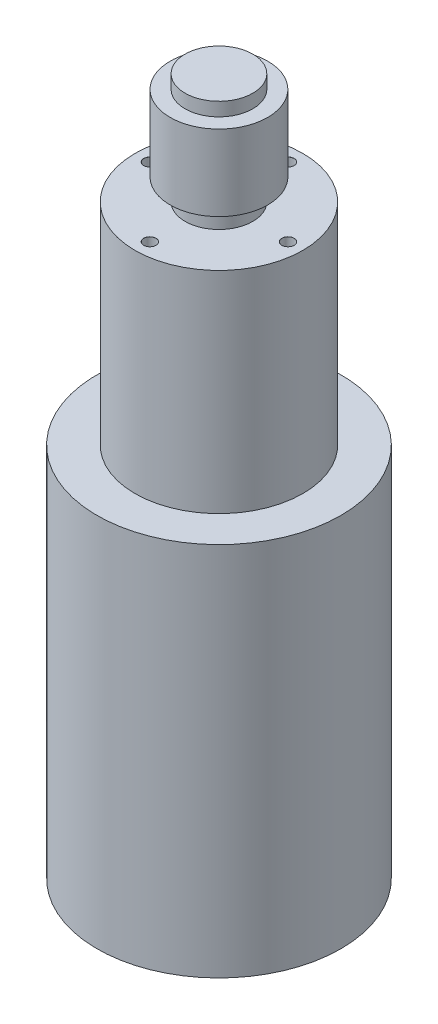
ISO-10303-21;
HEADER;
FILE_DESCRIPTION(('STEP AP214'),'2;1');
FILE_NAME('part.step','',(''),(''),'','','');
FILE_SCHEMA(('AUTOMOTIVE_DESIGN { 1 0 10303 214 1 1 1 1 }'));
ENDSEC;
DATA;
#1=APPLICATION_CONTEXT('core data for automotive mechanical design processes');
#2=APPLICATION_PROTOCOL_DEFINITION('international standard','automotive_design',2000,#1);
#3=PRODUCT_CONTEXT('',#1,'mechanical');
#4=PRODUCT('Part','Part','',(#3));
#5=PRODUCT_RELATED_PRODUCT_CATEGORY('part','',(#4));
#6=PRODUCT_DEFINITION_FORMATION('','',#4);
#7=PRODUCT_DEFINITION_CONTEXT('part definition',#1,'design');
#8=PRODUCT_DEFINITION('design','',#6,#7);
#9=PRODUCT_DEFINITION_SHAPE('','',#8);
#10=(LENGTH_UNIT() NAMED_UNIT(*) SI_UNIT(.MILLI.,.METRE.));
#11=(NAMED_UNIT(*) PLANE_ANGLE_UNIT() SI_UNIT($,.RADIAN.));
#12=(NAMED_UNIT(*) SI_UNIT($,.STERADIAN.) SOLID_ANGLE_UNIT());
#13=UNCERTAINTY_MEASURE_WITH_UNIT(LENGTH_MEASURE(1.E-05),#10,'distance_accuracy_value','');
#14=(GEOMETRIC_REPRESENTATION_CONTEXT(3) GLOBAL_UNCERTAINTY_ASSIGNED_CONTEXT((#13)) GLOBAL_UNIT_ASSIGNED_CONTEXT((#10,
#11,#12)) REPRESENTATION_CONTEXT('',''));
#15=CARTESIAN_POINT('',(0.,0.,0.));
#16=DIRECTION('',(0.,0.,1.));
#17=DIRECTION('',(1.,0.,0.));
#18=AXIS2_PLACEMENT_3D('',#15,#16,#17);
#19=CARTESIAN_POINT('',(0.,257.3,0.));
#20=DIRECTION('',(0.,1.,0.));
#21=DIRECTION('',(-1.,0.,0.));
#22=AXIS2_PLACEMENT_3D('',#19,#20,#21);
#23=PLANE('',#22);
#24=CARTESIAN_POINT('',(-8.82603067413309E-13,257.3,0.));
#25=DIRECTION('',(0.,-1.,0.));
#26=DIRECTION('',(1.,0.,0.));
#27=AXIS2_PLACEMENT_3D('',#24,#25,#26);
#28=CIRCLE('',#27,12.5000000000009);
#29=CARTESIAN_POINT('',(12.5,257.3,0.));
#30=VERTEX_POINT('',#29);
#31=EDGE_CURVE('E11',#30,#30,#28,.T.);
#32=ORIENTED_EDGE('',*,*,#31,.F.);
#33=EDGE_LOOP('',(#32));
#34=FACE_BOUND('',#33,.T.);
#35=ADVANCED_FACE('F32',(#34),#23,.T.);
#36=CARTESIAN_POINT('',(4.05590653340269E-12,-1182.39420366281,0.));
#37=DIRECTION('',(0.,-1.,0.));
#38=DIRECTION('',(1.,0.,0.));
#39=AXIS2_PLACEMENT_3D('',#36,#37,#38);
#40=CYLINDRICAL_SURFACE('',#39,12.5000000000009);
#41=ORIENTED_EDGE('',*,*,#31,.T.);
#42=EDGE_LOOP('',(#41));
#43=FACE_BOUND('',#42,.T.);
#44=CARTESIAN_POINT('',(-8.6545182241888E-13,252.3,0.));
#45=DIRECTION('',(0.,-1.,0.));
#46=DIRECTION('',(1.,0.,0.));
#47=AXIS2_PLACEMENT_3D('',#44,#45,#46);
#48=CIRCLE('',#47,12.5000000000009);
#49=CARTESIAN_POINT('',(12.5,252.3,0.));
#50=VERTEX_POINT('',#49);
#51=EDGE_CURVE('E39',#50,#50,#48,.T.);
#52=ORIENTED_EDGE('',*,*,#51,.F.);
#53=EDGE_LOOP('',(#52));
#54=FACE_BOUND('',#53,.T.);
#55=ADVANCED_FACE('F125',(#43,#54),#40,.T.);
#56=CARTESIAN_POINT('',(12.5,252.3,0.));
#57=DIRECTION('',(0.,1.,0.));
#58=DIRECTION('',(-1.,0.,0.));
#59=AXIS2_PLACEMENT_3D('',#56,#57,#58);
#60=PLANE('',#59);
#61=ORIENTED_EDGE('',*,*,#51,.T.);
#62=EDGE_LOOP('',(#61));
#63=FACE_BOUND('',#62,.T.);
#64=CARTESIAN_POINT('',(-8.6545182241888E-13,252.3,0.));
#65=DIRECTION('',(0.,-1.,0.));
#66=DIRECTION('',(1.,0.,0.));
#67=AXIS2_PLACEMENT_3D('',#64,#65,#66);
#68=CIRCLE('',#67,18.0000000000009);
#69=CARTESIAN_POINT('',(18.,252.3,0.));
#70=VERTEX_POINT('',#69);
#71=EDGE_CURVE('E117',#70,#70,#68,.T.);
#72=ORIENTED_EDGE('',*,*,#71,.F.);
#73=EDGE_LOOP('',(#72));
#74=FACE_BOUND('',#73,.T.);
#75=ADVANCED_FACE('F122',(#63,#74),#60,.T.);
#76=CARTESIAN_POINT('',(4.05590653340269E-12,-1182.39420366281,0.));
#77=DIRECTION('',(0.,-1.,0.));
#78=DIRECTION('',(1.,0.,0.));
#79=AXIS2_PLACEMENT_3D('',#76,#77,#78);
#80=CYLINDRICAL_SURFACE('',#79,18.0000000000008);
#81=ORIENTED_EDGE('',*,*,#71,.T.);
#82=EDGE_LOOP('',(#81));
#83=FACE_BOUND('',#82,.T.);
#84=CARTESIAN_POINT('',(-7.69404850450078E-13,224.3,0.));
#85=DIRECTION('',(0.,-1.,0.));
#86=DIRECTION('',(1.,0.,0.));
#87=AXIS2_PLACEMENT_3D('',#84,#85,#86);
#88=CIRCLE('',#87,18.0000000000008);
#89=CARTESIAN_POINT('',(18.,224.3,0.));
#90=VERTEX_POINT('',#89);
#91=EDGE_CURVE('E114',#90,#90,#88,.T.);
#92=ORIENTED_EDGE('',*,*,#91,.F.);
#93=EDGE_LOOP('',(#92));
#94=FACE_BOUND('',#93,.T.);
#95=ADVANCED_FACE('F132',(#83,#94),#80,.T.);
#96=CARTESIAN_POINT('',(18.,224.3,0.));
#97=DIRECTION('',(0.,-1.,0.));
#98=DIRECTION('',(1.,0.,0.));
#99=AXIS2_PLACEMENT_3D('',#96,#97,#98);
#100=PLANE('',#99);
#101=ORIENTED_EDGE('',*,*,#91,.T.);
#102=EDGE_LOOP('',(#101));
#103=FACE_BOUND('',#102,.T.);
#104=CARTESIAN_POINT('',(-7.69404850450078E-13,224.3,0.));
#105=DIRECTION('',(0.,-1.,0.));
#106=DIRECTION('',(1.,0.,0.));
#107=AXIS2_PLACEMENT_3D('',#104,#105,#106);
#108=CIRCLE('',#107,12.5000000000008);
#109=CARTESIAN_POINT('',(12.5,224.3,0.));
#110=VERTEX_POINT('',#109);
#111=EDGE_CURVE('E111',#110,#110,#108,.T.);
#112=ORIENTED_EDGE('',*,*,#111,.F.);
#113=EDGE_LOOP('',(#112));
#114=FACE_BOUND('',#113,.T.);
#115=ADVANCED_FACE('F138',(#103,#114),#100,.T.);
#116=CARTESIAN_POINT('',(4.05590653340269E-12,-1182.39420366281,0.));
#117=DIRECTION('',(0.,-1.,0.));
#118=DIRECTION('',(1.,0.,0.));
#119=AXIS2_PLACEMENT_3D('',#116,#117,#118);
#120=CYLINDRICAL_SURFACE('',#119,12.5000000000008);
#121=ORIENTED_EDGE('',*,*,#111,.T.);
#122=EDGE_LOOP('',(#121));
#123=FACE_BOUND('',#122,.T.);
#124=CARTESIAN_POINT('',(-7.41962858458992E-13,216.3,0.));
#125=DIRECTION('',(0.,-1.,0.));
#126=DIRECTION('',(1.,0.,0.));
#127=AXIS2_PLACEMENT_3D('',#124,#125,#126);
#128=CIRCLE('',#127,12.5000000000007);
#129=CARTESIAN_POINT('',(12.5,216.3,0.));
#130=VERTEX_POINT('',#129);
#131=EDGE_CURVE('E108',#130,#130,#128,.T.);
#132=ORIENTED_EDGE('',*,*,#131,.F.);
#133=EDGE_LOOP('',(#132));
#134=FACE_BOUND('',#133,.T.);
#135=ADVANCED_FACE('F142',(#123,#134),#120,.T.);
#136=CARTESIAN_POINT('',(12.5,216.3,0.));
#137=DIRECTION('',(0.,1.,0.));
#138=DIRECTION('',(-1.,0.,0.));
#139=AXIS2_PLACEMENT_3D('',#136,#137,#138);
#140=PLANE('',#139);
#141=CARTESIAN_POINT('',(-7.41962858458991E-13,216.3,-25.5));
#142=DIRECTION('',(0.,1.,0.));
#143=DIRECTION('',(0.,0.,1.));
#144=AXIS2_PLACEMENT_3D('',#141,#142,#143);
#145=CIRCLE('',#144,2.275);
#146=CARTESIAN_POINT('',(-7.41962858458991E-13,216.3,-23.225));
#147=VERTEX_POINT('',#146);
#148=EDGE_CURVE('E69',#147,#147,#145,.T.);
#149=ORIENTED_EDGE('',*,*,#148,.F.);
#150=EDGE_LOOP('',(#149));
#151=FACE_BOUND('',#150,.T.);
#152=CARTESIAN_POINT('',(25.4999999999993,216.3,0.));
#153=DIRECTION('',(0.,1.,0.));
#154=DIRECTION('',(0.,0.,1.));
#155=AXIS2_PLACEMENT_3D('',#152,#153,#154);
#156=CIRCLE('',#155,2.275);
#157=CARTESIAN_POINT('',(25.4999999999993,216.3,2.275));
#158=VERTEX_POINT('',#157);
#159=EDGE_CURVE('E62',#158,#158,#156,.T.);
#160=ORIENTED_EDGE('',*,*,#159,.F.);
#161=EDGE_LOOP('',(#160));
#162=FACE_BOUND('',#161,.T.);
#163=CARTESIAN_POINT('',(-7.41962858458991E-13,216.3,25.5));
#164=DIRECTION('',(0.,1.,0.));
#165=DIRECTION('',(0.,0.,1.));
#166=AXIS2_PLACEMENT_3D('',#163,#164,#165);
#167=CIRCLE('',#166,2.275);
#168=CARTESIAN_POINT('',(-7.41962858458991E-13,216.3,27.775));
#169=VERTEX_POINT('',#168);
#170=EDGE_CURVE('E78',#169,#169,#167,.T.);
#171=ORIENTED_EDGE('',*,*,#170,.F.);
#172=EDGE_LOOP('',(#171));
#173=FACE_BOUND('',#172,.T.);
#174=CARTESIAN_POINT('',(-25.5000000000007,216.3,0.));
#175=DIRECTION('',(0.,1.,0.));
#176=DIRECTION('',(0.,0.,1.));
#177=AXIS2_PLACEMENT_3D('',#174,#175,#176);
#178=CIRCLE('',#177,2.275);
#179=CARTESIAN_POINT('',(-25.5000000000007,216.3,2.275));
#180=VERTEX_POINT('',#179);
#181=EDGE_CURVE('E87',#180,#180,#178,.T.);
#182=ORIENTED_EDGE('',*,*,#181,.F.);
#183=EDGE_LOOP('',(#182));
#184=FACE_BOUND('',#183,.T.);
#185=ORIENTED_EDGE('',*,*,#131,.T.);
#186=EDGE_LOOP('',(#185));
#187=FACE_BOUND('',#186,.T.);
#188=CARTESIAN_POINT('',(-7.41962858458992E-13,216.3,0.));
#189=DIRECTION('',(0.,-1.,0.));
#190=DIRECTION('',(1.,0.,0.));
#191=AXIS2_PLACEMENT_3D('',#188,#189,#190);
#192=CIRCLE('',#191,31.0000000000007);
#193=CARTESIAN_POINT('',(31.,216.3,0.));
#194=VERTEX_POINT('',#193);
#195=EDGE_CURVE('E105',#194,#194,#192,.T.);
#196=ORIENTED_EDGE('',*,*,#195,.F.);
#197=EDGE_LOOP('',(#196));
#198=FACE_BOUND('',#197,.T.);
#199=ADVANCED_FACE('F146',(#151,#162,#173,#184,#187,#198),#140,.T.);
#200=CARTESIAN_POINT('',(4.05590653340269E-12,-1182.39420366281,0.));
#201=DIRECTION('',(0.,-1.,0.));
#202=DIRECTION('',(1.,0.,0.));
#203=AXIS2_PLACEMENT_3D('',#200,#201,#202);
#204=CYLINDRICAL_SURFACE('',#203,31.0000000000006);
#205=ORIENTED_EDGE('',*,*,#195,.T.);
#206=EDGE_LOOP('',(#205));
#207=FACE_BOUND('',#206,.T.);
#208=CARTESIAN_POINT('',(-4.75260998795624E-13,138.55,0.));
#209=DIRECTION('',(0.,-1.,0.));
#210=DIRECTION('',(1.,0.,0.));
#211=AXIS2_PLACEMENT_3D('',#208,#209,#210);
#212=CIRCLE('',#211,31.0000000000005);
#213=CARTESIAN_POINT('',(31.,138.55,0.));
#214=VERTEX_POINT('',#213);
#215=EDGE_CURVE('E102',#214,#214,#212,.T.);
#216=ORIENTED_EDGE('',*,*,#215,.F.);
#217=EDGE_LOOP('',(#216));
#218=FACE_BOUND('',#217,.T.);
#219=ADVANCED_FACE('F150',(#207,#218),#204,.T.);
#220=CARTESIAN_POINT('',(31.,138.55,0.));
#221=DIRECTION('',(0.,1.,0.));
#222=DIRECTION('',(-1.,0.,0.));
#223=AXIS2_PLACEMENT_3D('',#220,#221,#222);
#224=PLANE('',#223);
#225=ORIENTED_EDGE('',*,*,#215,.T.);
#226=EDGE_LOOP('',(#225));
#227=FACE_BOUND('',#226,.T.);
#228=CARTESIAN_POINT('',(-4.75260998795623E-13,138.55,0.));
#229=DIRECTION('',(0.,-1.,0.));
#230=DIRECTION('',(1.,0.,0.));
#231=AXIS2_PLACEMENT_3D('',#228,#229,#230);
#232=CIRCLE('',#231,45.0000000000005);
#233=CARTESIAN_POINT('',(45.,138.55,0.));
#234=VERTEX_POINT('',#233);
#235=EDGE_CURVE('E99',#234,#234,#232,.T.);
#236=ORIENTED_EDGE('',*,*,#235,.F.);
#237=EDGE_LOOP('',(#236));
#238=FACE_BOUND('',#237,.T.);
#239=ADVANCED_FACE('F154',(#227,#238),#224,.T.);
#240=CARTESIAN_POINT('',(4.05590653340269E-12,-1182.39420366281,0.));
#241=DIRECTION('',(0.,-1.,0.));
#242=DIRECTION('',(1.,0.,0.));
#243=AXIS2_PLACEMENT_3D('',#240,#241,#242);
#244=CYLINDRICAL_SURFACE('',#243,45.0000000000002);
#245=ORIENTED_EDGE('',*,*,#235,.T.);
#246=EDGE_LOOP('',(#245));
#247=FACE_BOUND('',#246,.T.);
#248=CARTESIAN_POINT('',(0.,-2.22044604925031E-13,0.));
#249=DIRECTION('',(0.,-1.,0.));
#250=DIRECTION('',(1.,0.,0.));
#251=AXIS2_PLACEMENT_3D('',#248,#249,#250);
#252=CIRCLE('',#251,45.);
#253=CARTESIAN_POINT('',(45.,0.,0.));
#254=VERTEX_POINT('',#253);
#255=EDGE_CURVE('E96',#254,#254,#252,.T.);
#256=ORIENTED_EDGE('',*,*,#255,.F.);
#257=EDGE_LOOP('',(#256));
#258=FACE_BOUND('',#257,.T.);
#259=ADVANCED_FACE('F158',(#247,#258),#244,.T.);
#260=CARTESIAN_POINT('',(45.,0.,0.));
#261=DIRECTION('',(0.,-1.,0.));
#262=DIRECTION('',(1.,0.,0.));
#263=AXIS2_PLACEMENT_3D('',#260,#261,#262);
#264=PLANE('',#263);
#265=ORIENTED_EDGE('',*,*,#255,.T.);
#266=EDGE_LOOP('',(#265));
#267=FACE_BOUND('',#266,.T.);
#268=ADVANCED_FACE('F162',(#267),#264,.T.);
#269=CARTESIAN_POINT('',(-25.5000000000007,199.3,0.));
#270=DIRECTION('',(0.,1.,0.));
#271=DIRECTION('',(0.,0.,1.));
#272=AXIS2_PLACEMENT_3D('',#269,#270,#271);
#273=CONICAL_SURFACE('',#272,2.25,1.02974425867666);
#274=CARTESIAN_POINT('',(-25.5000000000007,197.948063607188,0.));
#275=VERTEX_POINT('',#274);
#276=VERTEX_LOOP('',#275);
#277=FACE_BOUND('',#276,.T.);
#278=CARTESIAN_POINT('',(-25.5000000000007,199.3,0.));
#279=DIRECTION('',(0.,1.,0.));
#280=DIRECTION('',(0.,0.,1.));
#281=AXIS2_PLACEMENT_3D('',#278,#279,#280);
#282=CIRCLE('',#281,2.25);
#283=CARTESIAN_POINT('',(-25.5000000000007,199.3,2.25));
#284=VERTEX_POINT('',#283);
#285=EDGE_CURVE('E93',#284,#284,#282,.T.);
#286=ORIENTED_EDGE('',*,*,#285,.T.);
#287=EDGE_LOOP('',(#286));
#288=FACE_BOUND('',#287,.T.);
#289=ADVANCED_FACE('F166',(#277,#288),#273,.F.);
#290=CARTESIAN_POINT('',(-25.5000000000007,216.3,0.));
#291=DIRECTION('',(0.,1.,0.));
#292=DIRECTION('',(0.,0.,1.));
#293=AXIS2_PLACEMENT_3D('',#290,#291,#292);
#294=CYLINDRICAL_SURFACE('',#293,2.25);
#295=ORIENTED_EDGE('',*,*,#285,.F.);
#296=EDGE_LOOP('',(#295));
#297=FACE_BOUND('',#296,.T.);
#298=CARTESIAN_POINT('',(-25.5000000000007,216.275,0.));
#299=DIRECTION('',(0.,1.,0.));
#300=DIRECTION('',(0.,0.,1.));
#301=AXIS2_PLACEMENT_3D('',#298,#299,#300);
#302=CIRCLE('',#301,2.25);
#303=CARTESIAN_POINT('',(-25.5000000000007,216.275,2.25));
#304=VERTEX_POINT('',#303);
#305=EDGE_CURVE('E90',#304,#304,#302,.T.);
#306=ORIENTED_EDGE('',*,*,#305,.T.);
#307=EDGE_LOOP('',(#306));
#308=FACE_BOUND('',#307,.T.);
#309=ADVANCED_FACE('F170',(#297,#308),#294,.F.);
#310=CARTESIAN_POINT('',(-25.5000000000007,216.3,0.));
#311=DIRECTION('',(0.,1.,0.));
#312=DIRECTION('',(0.,0.,1.));
#313=AXIS2_PLACEMENT_3D('',#310,#311,#312);
#314=CONICAL_SURFACE('',#313,2.275,0.785398163397518);
#315=ORIENTED_EDGE('',*,*,#305,.F.);
#316=EDGE_LOOP('',(#315));
#317=FACE_BOUND('',#316,.T.);
#318=ORIENTED_EDGE('',*,*,#181,.T.);
#319=EDGE_LOOP('',(#318));
#320=FACE_BOUND('',#319,.T.);
#321=ADVANCED_FACE('F173',(#317,#320),#314,.F.);
#322=CARTESIAN_POINT('',(-7.41962858458991E-13,199.3,25.5));
#323=DIRECTION('',(0.,1.,0.));
#324=DIRECTION('',(0.,0.,1.));
#325=AXIS2_PLACEMENT_3D('',#322,#323,#324);
#326=CONICAL_SURFACE('',#325,2.25,1.02974425867665);
#327=CARTESIAN_POINT('',(-7.46438464052316E-13,197.948063607188,25.5));
#328=VERTEX_POINT('',#327);
#329=VERTEX_LOOP('',#328);
#330=FACE_BOUND('',#329,.T.);
#331=CARTESIAN_POINT('',(-7.41962858458991E-13,199.3,25.5));
#332=DIRECTION('',(0.,1.,0.));
#333=DIRECTION('',(0.,0.,1.));
#334=AXIS2_PLACEMENT_3D('',#331,#332,#333);
#335=CIRCLE('',#334,2.25);
#336=CARTESIAN_POINT('',(-7.41962858458991E-13,199.3,27.75));
#337=VERTEX_POINT('',#336);
#338=EDGE_CURVE('E84',#337,#337,#335,.T.);
#339=ORIENTED_EDGE('',*,*,#338,.T.);
#340=EDGE_LOOP('',(#339));
#341=FACE_BOUND('',#340,.T.);
#342=ADVANCED_FACE('F177',(#330,#341),#326,.F.);
#343=CARTESIAN_POINT('',(-7.41962858458991E-13,216.3,25.5));
#344=DIRECTION('',(0.,1.,0.));
#345=DIRECTION('',(0.,0.,1.));
#346=AXIS2_PLACEMENT_3D('',#343,#344,#345);
#347=CYLINDRICAL_SURFACE('',#346,2.25);
#348=ORIENTED_EDGE('',*,*,#338,.F.);
#349=EDGE_LOOP('',(#348));
#350=FACE_BOUND('',#349,.T.);
#351=CARTESIAN_POINT('',(-7.41962858458991E-13,216.275,25.5));
#352=DIRECTION('',(0.,1.,0.));
#353=DIRECTION('',(0.,0.,1.));
#354=AXIS2_PLACEMENT_3D('',#351,#352,#353);
#355=CIRCLE('',#354,2.25);
#356=CARTESIAN_POINT('',(-7.41962858458991E-13,216.275,27.75));
#357=VERTEX_POINT('',#356);
#358=EDGE_CURVE('E81',#357,#357,#355,.T.);
#359=ORIENTED_EDGE('',*,*,#358,.T.);
#360=EDGE_LOOP('',(#359));
#361=FACE_BOUND('',#360,.T.);
#362=ADVANCED_FACE('F181',(#350,#361),#347,.F.);
#363=CARTESIAN_POINT('',(-7.41962858458991E-13,216.3,25.5));
#364=DIRECTION('',(0.,1.,0.));
#365=DIRECTION('',(0.,0.,1.));
#366=AXIS2_PLACEMENT_3D('',#363,#364,#365);
#367=CONICAL_SURFACE('',#366,2.275,0.785398163397535);
#368=ORIENTED_EDGE('',*,*,#358,.F.);
#369=EDGE_LOOP('',(#368));
#370=FACE_BOUND('',#369,.T.);
#371=ORIENTED_EDGE('',*,*,#170,.T.);
#372=EDGE_LOOP('',(#371));
#373=FACE_BOUND('',#372,.T.);
#374=ADVANCED_FACE('F184',(#370,#373),#367,.F.);
#375=CARTESIAN_POINT('',(25.4999999999993,199.3,0.));
#376=DIRECTION('',(0.,1.,0.));
#377=DIRECTION('',(0.,0.,1.));
#378=AXIS2_PLACEMENT_3D('',#375,#376,#377);
#379=CONICAL_SURFACE('',#378,2.25,1.02974425867666);
#380=CARTESIAN_POINT('',(25.4999999999993,197.948063607188,0.));
#381=VERTEX_POINT('',#380);
#382=VERTEX_LOOP('',#381);
#383=FACE_BOUND('',#382,.T.);
#384=CARTESIAN_POINT('',(25.4999999999993,199.3,0.));
#385=DIRECTION('',(0.,1.,0.));
#386=DIRECTION('',(0.,0.,1.));
#387=AXIS2_PLACEMENT_3D('',#384,#385,#386);
#388=CIRCLE('',#387,2.25);
#389=CARTESIAN_POINT('',(25.4999999999993,199.3,2.25));
#390=VERTEX_POINT('',#389);
#391=EDGE_CURVE('E75',#390,#390,#388,.T.);
#392=ORIENTED_EDGE('',*,*,#391,.T.);
#393=EDGE_LOOP('',(#392));
#394=FACE_BOUND('',#393,.T.);
#395=ADVANCED_FACE('F188',(#383,#394),#379,.F.);
#396=CARTESIAN_POINT('',(25.4999999999993,216.3,0.));
#397=DIRECTION('',(0.,1.,0.));
#398=DIRECTION('',(0.,0.,1.));
#399=AXIS2_PLACEMENT_3D('',#396,#397,#398);
#400=CYLINDRICAL_SURFACE('',#399,2.25);
#401=ORIENTED_EDGE('',*,*,#391,.F.);
#402=EDGE_LOOP('',(#401));
#403=FACE_BOUND('',#402,.T.);
#404=CARTESIAN_POINT('',(25.4999999999993,216.275,0.));
#405=DIRECTION('',(0.,1.,0.));
#406=DIRECTION('',(0.,0.,1.));
#407=AXIS2_PLACEMENT_3D('',#404,#405,#406);
#408=CIRCLE('',#407,2.25);
#409=CARTESIAN_POINT('',(25.4999999999993,216.275,2.25));
#410=VERTEX_POINT('',#409);
#411=EDGE_CURVE('E66',#410,#410,#408,.T.);
#412=ORIENTED_EDGE('',*,*,#411,.T.);
#413=EDGE_LOOP('',(#412));
#414=FACE_BOUND('',#413,.T.);
#415=ADVANCED_FACE('F192',(#403,#414),#400,.F.);
#416=CARTESIAN_POINT('',(25.4999999999993,216.3,0.));
#417=DIRECTION('',(0.,1.,0.));
#418=DIRECTION('',(0.,0.,1.));
#419=AXIS2_PLACEMENT_3D('',#416,#417,#418);
#420=CONICAL_SURFACE('',#419,2.275,0.785398163397518);
#421=ORIENTED_EDGE('',*,*,#411,.F.);
#422=EDGE_LOOP('',(#421));
#423=FACE_BOUND('',#422,.T.);
#424=ORIENTED_EDGE('',*,*,#159,.T.);
#425=EDGE_LOOP('',(#424));
#426=FACE_BOUND('',#425,.T.);
#427=ADVANCED_FACE('F56',(#423,#426),#420,.F.);
#428=CARTESIAN_POINT('',(-7.41962858458991E-13,199.3,-25.5));
#429=DIRECTION('',(0.,1.,0.));
#430=DIRECTION('',(0.,0.,1.));
#431=AXIS2_PLACEMENT_3D('',#428,#429,#430);
#432=CONICAL_SURFACE('',#431,2.25,1.02974425867665);
#433=CARTESIAN_POINT('',(-7.46438464052316E-13,197.948063607188,-25.5));
#434=VERTEX_POINT('',#433);
#435=VERTEX_LOOP('',#434);
#436=FACE_BOUND('',#435,.T.);
#437=CARTESIAN_POINT('',(-7.41962858458991E-13,199.3,-25.5));
#438=DIRECTION('',(0.,1.,0.));
#439=DIRECTION('',(0.,0.,1.));
#440=AXIS2_PLACEMENT_3D('',#437,#438,#439);
#441=CIRCLE('',#440,2.25);
#442=CARTESIAN_POINT('',(-7.41962858458991E-13,199.3,-23.25));
#443=VERTEX_POINT('',#442);
#444=EDGE_CURVE('E60',#443,#443,#441,.T.);
#445=ORIENTED_EDGE('',*,*,#444,.T.);
#446=EDGE_LOOP('',(#445));
#447=FACE_BOUND('',#446,.T.);
#448=ADVANCED_FACE('F52',(#436,#447),#432,.F.);
#449=CARTESIAN_POINT('',(-7.41962858458991E-13,216.3,-25.5));
#450=DIRECTION('',(0.,1.,0.));
#451=DIRECTION('',(0.,0.,1.));
#452=AXIS2_PLACEMENT_3D('',#449,#450,#451);
#453=CYLINDRICAL_SURFACE('',#452,2.25);
#454=ORIENTED_EDGE('',*,*,#444,.F.);
#455=EDGE_LOOP('',(#454));
#456=FACE_BOUND('',#455,.T.);
#457=CARTESIAN_POINT('',(-7.41962858458991E-13,216.275,-25.5));
#458=DIRECTION('',(0.,1.,0.));
#459=DIRECTION('',(0.,0.,1.));
#460=AXIS2_PLACEMENT_3D('',#457,#458,#459);
#461=CIRCLE('',#460,2.25);
#462=CARTESIAN_POINT('',(-7.41962858458991E-13,216.275,-23.25));
#463=VERTEX_POINT('',#462);
#464=EDGE_CURVE('E63',#463,#463,#461,.T.);
#465=ORIENTED_EDGE('',*,*,#464,.T.);
#466=EDGE_LOOP('',(#465));
#467=FACE_BOUND('',#466,.T.);
#468=ADVANCED_FACE('F55',(#456,#467),#453,.F.);
#469=CARTESIAN_POINT('',(-7.41962858458991E-13,216.3,-25.5));
#470=DIRECTION('',(0.,1.,0.));
#471=DIRECTION('',(0.,0.,1.));
#472=AXIS2_PLACEMENT_3D('',#469,#470,#471);
#473=CONICAL_SURFACE('',#472,2.275,0.785398163397535);
#474=ORIENTED_EDGE('',*,*,#464,.F.);
#475=EDGE_LOOP('',(#474));
#476=FACE_BOUND('',#475,.T.);
#477=ORIENTED_EDGE('',*,*,#148,.T.);
#478=EDGE_LOOP('',(#477));
#479=FACE_BOUND('',#478,.T.);
#480=ADVANCED_FACE('F202',(#476,#479),#473,.F.);
#481=CLOSED_SHELL('',(#35,#55,#75,#95,#115,#135,#199,#219,#239,#259,#268,#289,#309,#321,#342,
#362,#374,#395,#415,#427,#448,#468,#480));
#482=MANIFOLD_SOLID_BREP('B2',#481);
#483=ADVANCED_BREP_SHAPE_REPRESENTATION('',(#18,#482),#14);
#484=SHAPE_DEFINITION_REPRESENTATION(#9,#483);
ENDSEC;
END-ISO-10303-21;
